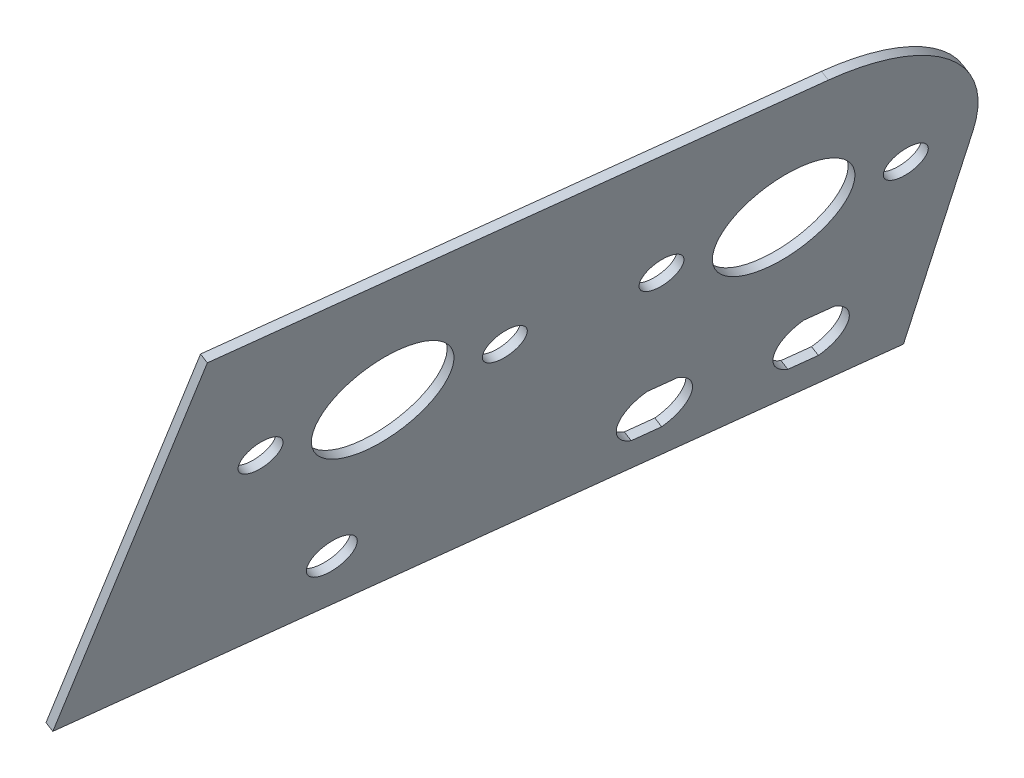
ISO-10303-21;
HEADER;
FILE_DESCRIPTION(('STEP AP214'),'2;1');
FILE_NAME('part.step','',(''),(''),'','','');
FILE_SCHEMA(('AUTOMOTIVE_DESIGN { 1 0 10303 214 1 1 1 1 }'));
ENDSEC;
DATA;
#1=APPLICATION_CONTEXT('core data for automotive mechanical design processes');
#2=APPLICATION_PROTOCOL_DEFINITION('international standard','automotive_design',2000,#1);
#3=PRODUCT_CONTEXT('',#1,'mechanical');
#4=PRODUCT('Part','Part','',(#3));
#5=PRODUCT_RELATED_PRODUCT_CATEGORY('part','',(#4));
#6=PRODUCT_DEFINITION_FORMATION('','',#4);
#7=PRODUCT_DEFINITION_CONTEXT('part definition',#1,'design');
#8=PRODUCT_DEFINITION('design','',#6,#7);
#9=PRODUCT_DEFINITION_SHAPE('','',#8);
#10=(LENGTH_UNIT() NAMED_UNIT(*) SI_UNIT(.MILLI.,.METRE.));
#11=(NAMED_UNIT(*) PLANE_ANGLE_UNIT() SI_UNIT($,.RADIAN.));
#12=(NAMED_UNIT(*) SI_UNIT($,.STERADIAN.) SOLID_ANGLE_UNIT());
#13=UNCERTAINTY_MEASURE_WITH_UNIT(LENGTH_MEASURE(1.E-05),#10,'distance_accuracy_value','');
#14=(GEOMETRIC_REPRESENTATION_CONTEXT(3) GLOBAL_UNCERTAINTY_ASSIGNED_CONTEXT((#13)) GLOBAL_UNIT_ASSIGNED_CONTEXT((#10,
#11,#12)) REPRESENTATION_CONTEXT('',''));
#15=CARTESIAN_POINT('',(0.,0.,0.));
#16=DIRECTION('',(0.,0.,1.));
#17=DIRECTION('',(1.,0.,0.));
#18=AXIS2_PLACEMENT_3D('',#15,#16,#17);
#19=CARTESIAN_POINT('',(-325.727767332464,404.275308145903,-253.984029335948));
#20=DIRECTION('',(-0.923798474245107,0.360095662141425,-0.130105699680456));
#21=DIRECTION('',(-0.363182667764731,-0.931717956162321,0.));
#22=AXIS2_PLACEMENT_3D('',#19,#20,#21);
#23=PLANE('',#22);
#24=CARTESIAN_POINT('',(-322.735755727218,404.882734459944,-273.547232034563));
#25=DIRECTION('',(-0.923798474245107,0.360095662141425,-0.130105699680456));
#26=DIRECTION('',(-0.363182667764731,-0.931717956162321,0.));
#27=AXIS2_PLACEMENT_3D('',#24,#25,#26);
#28=CIRCLE('',#27,3.55);
#29=CARTESIAN_POINT('',(-324.025054197783,401.575135715567,-273.547232034563));
#30=VERTEX_POINT('',#29);
#31=EDGE_CURVE('E207',#30,#30,#28,.T.);
#32=ORIENTED_EDGE('',*,*,#31,.F.);
#33=EDGE_LOOP('',(#32));
#34=FACE_BOUND('',#33,.T.);
#35=CARTESIAN_POINT('',(-325.727767332464,404.275308145903,-253.984029335948));
#36=DIRECTION('',(-0.923798474245107,0.360095662141425,-0.130105699680456));
#37=DIRECTION('',(-0.363182667764731,-0.931717956162321,0.));
#38=AXIS2_PLACEMENT_3D('',#35,#36,#37);
#39=CIRCLE('',#38,11.25);
#40=CARTESIAN_POINT('',(-329.813572344817,393.793481139077,-253.984029335948));
#41=VERTEX_POINT('',#40);
#42=EDGE_CURVE('E219',#41,#41,#39,.T.);
#43=ORIENTED_EDGE('',*,*,#42,.F.);
#44=EDGE_LOOP('',(#43));
#45=FACE_BOUND('',#44,.T.);
#46=CARTESIAN_POINT('',(-338.542039257965,401.673805548396,-170.198191515619));
#47=DIRECTION('',(-0.923798474245107,0.360095662141425,-0.130105699680456));
#48=DIRECTION('',(-0.363182667764731,-0.931717956162321,0.));
#49=AXIS2_PLACEMENT_3D('',#46,#47,#48);
#50=CIRCLE('',#49,3.54999999999999);
#51=CARTESIAN_POINT('',(-339.83133772853,398.366206804019,-170.198191515619));
#52=VERTEX_POINT('',#51);
#53=EDGE_CURVE('E231',#52,#52,#50,.T.);
#54=ORIENTED_EDGE('',*,*,#53,.F.);
#55=EDGE_LOOP('',(#54));
#56=FACE_BOUND('',#55,.T.);
#57=DIRECTION('',(-0.351797717362219,-0.932410836751544,-0.0827550455683421));
#58=VECTOR('',#57,1.);
#59=CARTESIAN_POINT('',(-321.092416019791,405.216358761216,-284.292172910696));
#60=LINE('',#59,#58);
#61=CARTESIAN_POINT('',(-321.092416019791,405.216358761216,-284.292172910696));
#62=VERTEX_POINT('',#61);
#63=CARTESIAN_POINT('',(-337.846782309166,360.810292660924,-288.233381955888));
#64=VERTEX_POINT('',#63);
#65=EDGE_CURVE('E243',#62,#64,#60,.T.);
#66=ORIENTED_EDGE('',*,*,#65,.T.);
#67=DIRECTION('',(-0.151111697234675,-0.0306780966687199,0.98804054033407));
#68=VECTOR('',#67,1.);
#69=CARTESIAN_POINT('',(-337.846782309166,360.810292660924,-288.233381955888));
#70=LINE('',#69,#68);
#71=CARTESIAN_POINT('',(-358.684680395967,356.579865344056,-151.985239278129));
#72=VERTEX_POINT('',#71);
#73=EDGE_CURVE('E246',#64,#72,#70,.T.);
#74=ORIENTED_EDGE('',*,*,#73,.T.);
#75=DIRECTION('',(0.363182667764731,0.931717956162321,0.));
#76=VECTOR('',#75,1.);
#77=CARTESIAN_POINT('',(-358.684680395967,356.579865344056,-151.985239278129));
#78=LINE('',#77,#76);
#79=CARTESIAN_POINT('',(-330.147905643647,429.78882548342,-151.985239278129));
#80=VERTEX_POINT('',#79);
#81=EDGE_CURVE('E249',#72,#80,#78,.T.);
#82=ORIENTED_EDGE('',*,*,#81,.T.);
#83=DIRECTION('',(0.151111697234675,0.0306780966687195,-0.98804054033407));
#84=VECTOR('',#83,1.);
#85=CARTESIAN_POINT('',(-330.147905643647,429.78882548342,-151.985239278129));
#86=LINE('',#85,#84);
#87=CARTESIAN_POINT('',(-314.936372352378,432.877010563257,-251.44551831314));
#88=VERTEX_POINT('',#87);
#89=EDGE_CURVE('E251',#80,#88,#86,.T.);
#90=ORIENTED_EDGE('',*,*,#89,.T.);
#91=CARTESIAN_POINT('',(-325.727767332464,404.275308145903,-253.984029335948));
#92=DIRECTION('',(-0.923798474245107,0.360095662141425,-0.130105699680456));
#93=DIRECTION('',(-0.363182667764731,-0.931717956162321,0.));
#94=AXIS2_PLACEMENT_3D('',#91,#92,#93);
#95=CIRCLE('',#94,30.675);
#96=EDGE_CURVE('E253',#88,#62,#95,.T.);
#97=ORIENTED_EDGE('',*,*,#96,.T.);
#98=EDGE_LOOP('',(#66,#74,#82,#90,#97));
#99=FACE_BOUND('',#98,.T.);
#100=CARTESIAN_POINT('',(-335.550027652718,402.281231862436,-189.761394214234));
#101=DIRECTION('',(-0.923798474245107,0.360095662141425,-0.130105699680456));
#102=DIRECTION('',(-0.363182667764731,-0.931717956162321,0.));
#103=AXIS2_PLACEMENT_3D('',#100,#101,#102);
#104=CIRCLE('',#103,11.25);
#105=CARTESIAN_POINT('',(-339.635832665071,391.79940485561,-189.761394214234));
#106=VERTEX_POINT('',#105);
#107=EDGE_CURVE('E237',#106,#106,#104,.T.);
#108=ORIENTED_EDGE('',*,*,#107,.F.);
#109=EDGE_LOOP('',(#108));
#110=FACE_BOUND('',#109,.T.);
#111=CARTESIAN_POINT('',(-332.558016047472,402.888658176477,-209.324596912848));
#112=DIRECTION('',(-0.923798474245107,0.360095662141425,-0.130105699680456));
#113=DIRECTION('',(-0.363182667764731,-0.931717956162321,0.));
#114=AXIS2_PLACEMENT_3D('',#111,#112,#113);
#115=CIRCLE('',#114,3.55);
#116=CARTESIAN_POINT('',(-333.847314518036,399.581059432101,-209.324596912848));
#117=VERTEX_POINT('',#116);
#118=EDGE_CURVE('E225',#117,#117,#115,.T.);
#119=ORIENTED_EDGE('',*,*,#118,.F.);
#120=EDGE_LOOP('',(#119));
#121=FACE_BOUND('',#120,.T.);
#122=CARTESIAN_POINT('',(-328.719778937711,403.667881831862,-234.420826637334));
#123=DIRECTION('',(-0.923798474245107,0.360095662141425,-0.130105699680456));
#124=DIRECTION('',(-0.363182667764731,-0.931717956162321,0.));
#125=AXIS2_PLACEMENT_3D('',#122,#123,#124);
#126=CIRCLE('',#125,3.55000000000002);
#127=CARTESIAN_POINT('',(-330.009077408276,400.360283087486,-234.420826637334));
#128=VERTEX_POINT('',#127);
#129=EDGE_CURVE('E213',#128,#128,#126,.T.);
#130=ORIENTED_EDGE('',*,*,#129,.F.);
#131=EDGE_LOOP('',(#130));
#132=FACE_BOUND('',#131,.T.);
#133=CARTESIAN_POINT('',(-347.836562931594,369.716783388889,-192.651614180708));
#134=DIRECTION('',(-0.923798474245107,0.360095662141425,-0.130105699680456));
#135=DIRECTION('',(-0.363182667764731,-0.931717956162321,0.));
#136=AXIS2_PLACEMENT_3D('',#133,#134,#135);
#137=CIRCLE('',#136,4.024999951);
#138=CARTESIAN_POINT('',(-349.298373151551,365.966618660989,-192.651614180708));
#139=VERTEX_POINT('',#138);
#140=EDGE_CURVE('E201',#139,#139,#137,.T.);
#141=ORIENTED_EDGE('',*,*,#140,.F.);
#142=EDGE_LOOP('',(#141));
#143=FACE_BOUND('',#142,.T.);
#144=DIRECTION('',(-0.151111697234677,-0.0306780966686925,0.98804054033407));
#145=VECTOR('',#144,1.);
#146=CARTESIAN_POINT('',(-337.65651983906,367.048048873044,-272.319976325119));
#147=LINE('',#146,#145);
#148=CARTESIAN_POINT('',(-337.65651983906,367.048048873044,-272.319976325119));
#149=VERTEX_POINT('',#148);
#150=CARTESIAN_POINT('',(-338.403623164843,366.896374922785,-267.435057505463));
#151=VERTEX_POINT('',#150);
#152=EDGE_CURVE('E172',#149,#151,#147,.T.);
#153=ORIENTED_EDGE('',*,*,#152,.F.);
#154=CARTESIAN_POINT('',(-336.09518405646,372.100471500048,-269.422364164665));
#155=DIRECTION('',(-0.923798474245107,0.360095662141425,-0.130105699680456));
#156=DIRECTION('',(-0.363182667764731,-0.931717956162321,0.));
#157=AXIS2_PLACEMENT_3D('',#154,#155,#156);
#158=CIRCLE('',#157,6.03000000500028);
#159=CARTESIAN_POINT('',(-333.786744948076,377.304568077311,-271.409670823867));
#160=VERTEX_POINT('',#159);
#161=EDGE_CURVE('E170',#160,#149,#158,.T.);
#162=ORIENTED_EDGE('',*,*,#161,.F.);
#163=DIRECTION('',(0.151111697234676,0.0306780966687149,-0.98804054033407));
#164=VECTOR('',#163,1.);
#165=CARTESIAN_POINT('',(-333.786744948076,377.304568077311,-271.409670823867));
#166=LINE('',#165,#164);
#167=CARTESIAN_POINT('',(-334.533848273859,377.152894127052,-266.524752004212));
#168=VERTEX_POINT('',#167);
#169=EDGE_CURVE('E178',#168,#160,#166,.T.);
#170=ORIENTED_EDGE('',*,*,#169,.F.);
#171=CARTESIAN_POINT('',(-336.09518405646,372.100471500048,-269.422364164665));
#172=DIRECTION('',(-0.923798474245107,0.360095662141425,-0.130105699680456));
#173=DIRECTION('',(-0.363182667764731,-0.931717956162321,0.));
#174=AXIS2_PLACEMENT_3D('',#171,#172,#173);
#175=CIRCLE('',#174,6.03000000500027);
#176=EDGE_CURVE('E175',#151,#168,#175,.T.);
#177=ORIENTED_EDGE('',*,*,#176,.F.);
#178=EDGE_LOOP('',(#153,#162,#170,#177));
#179=FACE_BOUND('',#178,.T.);
#180=DIRECTION('',(-0.151111697234677,-0.0306780966687151,0.98804054033407));
#181=VECTOR('',#180,1.);
#182=CARTESIAN_POINT('',(-341.494756946892,366.26882522277,-247.22374660018));
#183=LINE('',#182,#181);
#184=CARTESIAN_POINT('',(-341.494756946892,366.26882522277,-247.22374660018));
#185=VERTEX_POINT('',#184);
#186=CARTESIAN_POINT('',(-342.241860272675,366.117151272512,-242.338827780524));
#187=VERTEX_POINT('',#186);
#188=EDGE_CURVE('E142',#185,#187,#183,.T.);
#189=ORIENTED_EDGE('',*,*,#188,.F.);
#190=CARTESIAN_POINT('',(-339.93342116622,371.321247844663,-244.32613444018));
#191=DIRECTION('',(-0.923798474245107,0.360095662141425,-0.130105699680456));
#192=DIRECTION('',(-0.363182667764731,-0.931717956162321,0.));
#193=AXIS2_PLACEMENT_3D('',#190,#191,#192);
#194=CIRCLE('',#193,6.02999999999982);
#195=CARTESIAN_POINT('',(-337.624982059765,376.525344416814,-246.313441099836));
#196=VERTEX_POINT('',#195);
#197=EDGE_CURVE('E134',#196,#185,#194,.T.);
#198=ORIENTED_EDGE('',*,*,#197,.F.);
#199=DIRECTION('',(0.151111697234677,0.0306780966687263,-0.988040540334069));
#200=VECTOR('',#199,1.);
#201=CARTESIAN_POINT('',(-337.624982059765,376.525344416814,-246.313441099836));
#202=LINE('',#201,#200);
#203=CARTESIAN_POINT('',(-338.372085385548,376.373670466555,-241.42852228018));
#204=VERTEX_POINT('',#203);
#205=EDGE_CURVE('E156',#204,#196,#202,.T.);
#206=ORIENTED_EDGE('',*,*,#205,.F.);
#207=CARTESIAN_POINT('',(-339.93342116622,371.321247844663,-244.32613444018));
#208=DIRECTION('',(-0.923798474245107,0.360095662141425,-0.130105699680456));
#209=DIRECTION('',(-0.363182667764731,-0.931717956162321,0.));
#210=AXIS2_PLACEMENT_3D('',#207,#208,#209);
#211=CIRCLE('',#210,6.02999999999978);
#212=EDGE_CURVE('E154',#187,#204,#211,.T.);
#213=ORIENTED_EDGE('',*,*,#212,.F.);
#214=EDGE_LOOP('',(#189,#198,#206,#213));
#215=FACE_BOUND('',#214,.T.);
#216=ADVANCED_FACE('F39',(#34,#45,#56,#99,#110,#121,#132,#143,#179,#215),#23,.T.);
#217=CARTESIAN_POINT('',(-324.2612372546,403.703656282254,-253.777486537706));
#218=DIRECTION('',(-0.923798474245107,0.360095662141425,-0.130105699680456));
#219=DIRECTION('',(-0.363182667764731,-0.931717956162321,0.));
#220=AXIS2_PLACEMENT_3D('',#217,#218,#219);
#221=PLANE('',#220);
#222=CARTESIAN_POINT('',(-334.628653978595,371.528819636399,-269.215821366423));
#223=DIRECTION('',(-0.923798474245107,0.360095662141425,-0.130105699680456));
#224=DIRECTION('',(-0.363182667764731,-0.931717956162321,0.));
#225=AXIS2_PLACEMENT_3D('',#222,#223,#224);
#226=CIRCLE('',#225,6.03000000500028);
#227=CARTESIAN_POINT('',(-332.320214870212,376.732916213662,-271.203128025625));
#228=VERTEX_POINT('',#227);
#229=CARTESIAN_POINT('',(-336.189989761196,366.476397009394,-272.113433526876));
#230=VERTEX_POINT('',#229);
#231=EDGE_CURVE('E150',#228,#230,#226,.T.);
#232=ORIENTED_EDGE('',*,*,#231,.T.);
#233=DIRECTION('',(-0.151111697234677,-0.0306780966686925,0.98804054033407));
#234=VECTOR('',#233,1.);
#235=CARTESIAN_POINT('',(-336.189989761196,366.476397009394,-272.113433526876));
#236=LINE('',#235,#234);
#237=CARTESIAN_POINT('',(-336.937093086979,366.324723059136,-267.22851470722));
#238=VERTEX_POINT('',#237);
#239=EDGE_CURVE('E183',#230,#238,#236,.T.);
#240=ORIENTED_EDGE('',*,*,#239,.T.);
#241=CARTESIAN_POINT('',(-334.628653978595,371.528819636399,-269.215821366423));
#242=DIRECTION('',(-0.923798474245107,0.360095662141425,-0.130105699680456));
#243=DIRECTION('',(-0.363182667764731,-0.931717956162321,0.));
#244=AXIS2_PLACEMENT_3D('',#241,#242,#243);
#245=CIRCLE('',#244,6.03000000500027);
#246=CARTESIAN_POINT('',(-333.067318195995,376.581242263403,-266.318209205969));
#247=VERTEX_POINT('',#246);
#248=EDGE_CURVE('E186',#238,#247,#245,.T.);
#249=ORIENTED_EDGE('',*,*,#248,.T.);
#250=DIRECTION('',(0.151111697234676,0.0306780966687149,-0.98804054033407));
#251=VECTOR('',#250,1.);
#252=CARTESIAN_POINT('',(-332.320214870212,376.732916213662,-271.203128025625));
#253=LINE('',#252,#251);
#254=EDGE_CURVE('E173',#247,#228,#253,.T.);
#255=ORIENTED_EDGE('',*,*,#254,.T.);
#256=EDGE_LOOP('',(#232,#240,#249,#255));
#257=FACE_BOUND('',#256,.T.);
#258=DIRECTION('',(-0.351797717362219,-0.932410836751544,-0.0827550455683421));
#259=VECTOR('',#258,1.);
#260=CARTESIAN_POINT('',(-319.625885941926,404.644706897567,-284.085630112453));
#261=LINE('',#260,#259);
#262=CARTESIAN_POINT('',(-319.625885941926,404.644706897567,-284.085630112453));
#263=VERTEX_POINT('',#262);
#264=CARTESIAN_POINT('',(-336.380252231302,360.238640797274,-288.026839157646));
#265=VERTEX_POINT('',#264);
#266=EDGE_CURVE('E240',#263,#265,#261,.T.);
#267=ORIENTED_EDGE('',*,*,#266,.F.);
#268=CARTESIAN_POINT('',(-324.2612372546,403.703656282254,-253.777486537706));
#269=DIRECTION('',(-0.923798474245107,0.360095662141425,-0.130105699680456));
#270=DIRECTION('',(-0.363182667764731,-0.931717956162321,0.));
#271=AXIS2_PLACEMENT_3D('',#268,#269,#270);
#272=CIRCLE('',#271,30.675);
#273=CARTESIAN_POINT('',(-313.469842274514,432.305358699607,-251.238975514897));
#274=VERTEX_POINT('',#273);
#275=EDGE_CURVE('E247',#274,#263,#272,.T.);
#276=ORIENTED_EDGE('',*,*,#275,.F.);
#277=DIRECTION('',(0.151111697234675,0.0306780966687195,-0.98804054033407));
#278=VECTOR('',#277,1.);
#279=CARTESIAN_POINT('',(-328.681375565783,429.21717361977,-151.778696479886));
#280=LINE('',#279,#278);
#281=CARTESIAN_POINT('',(-328.681375565783,429.21717361977,-151.778696479886));
#282=VERTEX_POINT('',#281);
#283=EDGE_CURVE('E262',#282,#274,#280,.T.);
#284=ORIENTED_EDGE('',*,*,#283,.F.);
#285=DIRECTION('',(0.363182667764731,0.931717956162321,0.));
#286=VECTOR('',#285,1.);
#287=CARTESIAN_POINT('',(-357.218150318102,356.008213480407,-151.778696479886));
#288=LINE('',#287,#286);
#289=CARTESIAN_POINT('',(-357.218150318102,356.008213480407,-151.778696479886));
#290=VERTEX_POINT('',#289);
#291=EDGE_CURVE('E260',#290,#282,#288,.T.);
#292=ORIENTED_EDGE('',*,*,#291,.F.);
#293=DIRECTION('',(-0.151111697234675,-0.0306780966687199,0.98804054033407));
#294=VECTOR('',#293,1.);
#295=CARTESIAN_POINT('',(-336.380252231302,360.238640797274,-288.026839157646));
#296=LINE('',#295,#294);
#297=EDGE_CURVE('E258',#265,#290,#296,.T.);
#298=ORIENTED_EDGE('',*,*,#297,.F.);
#299=EDGE_LOOP('',(#267,#276,#284,#292,#298));
#300=FACE_BOUND('',#299,.T.);
#301=CARTESIAN_POINT('',(-334.083497574854,401.709579998787,-189.554851415991));
#302=DIRECTION('',(-0.923798474245107,0.360095662141425,-0.130105699680456));
#303=DIRECTION('',(-0.363182667764731,-0.931717956162321,0.));
#304=AXIS2_PLACEMENT_3D('',#301,#302,#303);
#305=CIRCLE('',#304,11.25);
#306=CARTESIAN_POINT('',(-338.169302587207,391.227752991961,-189.554851415991));
#307=VERTEX_POINT('',#306);
#308=EDGE_CURVE('E234',#307,#307,#305,.T.);
#309=ORIENTED_EDGE('',*,*,#308,.T.);
#310=EDGE_LOOP('',(#309));
#311=FACE_BOUND('',#310,.T.);
#312=CARTESIAN_POINT('',(-337.075509180101,401.102153684746,-169.991648717377));
#313=DIRECTION('',(-0.923798474245107,0.360095662141425,-0.130105699680456));
#314=DIRECTION('',(-0.363182667764731,-0.931717956162321,0.));
#315=AXIS2_PLACEMENT_3D('',#312,#313,#314);
#316=CIRCLE('',#315,3.54999999999999);
#317=CARTESIAN_POINT('',(-338.364807650665,397.79455494037,-169.991648717377));
#318=VERTEX_POINT('',#317);
#319=EDGE_CURVE('E228',#318,#318,#316,.T.);
#320=ORIENTED_EDGE('',*,*,#319,.T.);
#321=EDGE_LOOP('',(#320));
#322=FACE_BOUND('',#321,.T.);
#323=CARTESIAN_POINT('',(-331.091485969607,402.317006312827,-209.118054114606));
#324=DIRECTION('',(-0.923798474245107,0.360095662141425,-0.130105699680456));
#325=DIRECTION('',(-0.363182667764731,-0.931717956162321,0.));
#326=AXIS2_PLACEMENT_3D('',#323,#324,#325);
#327=CIRCLE('',#326,3.55);
#328=CARTESIAN_POINT('',(-332.380784440172,399.009407568451,-209.118054114606));
#329=VERTEX_POINT('',#328);
#330=EDGE_CURVE('E222',#329,#329,#327,.T.);
#331=ORIENTED_EDGE('',*,*,#330,.T.);
#332=EDGE_LOOP('',(#331));
#333=FACE_BOUND('',#332,.T.);
#334=CARTESIAN_POINT('',(-324.2612372546,403.703656282254,-253.777486537706));
#335=DIRECTION('',(-0.923798474245107,0.360095662141425,-0.130105699680456));
#336=DIRECTION('',(-0.363182667764731,-0.931717956162321,0.));
#337=AXIS2_PLACEMENT_3D('',#334,#335,#336);
#338=CIRCLE('',#337,11.25);
#339=CARTESIAN_POINT('',(-328.347042266953,393.221829275427,-253.777486537706));
#340=VERTEX_POINT('',#339);
#341=EDGE_CURVE('E216',#340,#340,#338,.T.);
#342=ORIENTED_EDGE('',*,*,#341,.T.);
#343=EDGE_LOOP('',(#342));
#344=FACE_BOUND('',#343,.T.);
#345=CARTESIAN_POINT('',(-327.253248859847,403.096229968213,-234.214283839091));
#346=DIRECTION('',(-0.923798474245107,0.360095662141425,-0.130105699680456));
#347=DIRECTION('',(-0.363182667764731,-0.931717956162321,0.));
#348=AXIS2_PLACEMENT_3D('',#345,#346,#347);
#349=CIRCLE('',#348,3.55000000000002);
#350=CARTESIAN_POINT('',(-328.542547330412,399.788631223837,-234.214283839091));
#351=VERTEX_POINT('',#350);
#352=EDGE_CURVE('E210',#351,#351,#349,.T.);
#353=ORIENTED_EDGE('',*,*,#352,.T.);
#354=EDGE_LOOP('',(#353));
#355=FACE_BOUND('',#354,.T.);
#356=CARTESIAN_POINT('',(-321.269225649354,404.311082596294,-273.34068923632));
#357=DIRECTION('',(-0.923798474245107,0.360095662141425,-0.130105699680456));
#358=DIRECTION('',(-0.363182667764731,-0.931717956162321,0.));
#359=AXIS2_PLACEMENT_3D('',#356,#357,#358);
#360=CIRCLE('',#359,3.55);
#361=CARTESIAN_POINT('',(-322.558524119918,401.003483851918,-273.34068923632));
#362=VERTEX_POINT('',#361);
#363=EDGE_CURVE('E204',#362,#362,#360,.T.);
#364=ORIENTED_EDGE('',*,*,#363,.T.);
#365=EDGE_LOOP('',(#364));
#366=FACE_BOUND('',#365,.T.);
#367=CARTESIAN_POINT('',(-346.37003285373,369.145131525239,-192.445071382465));
#368=DIRECTION('',(-0.923798474245107,0.360095662141425,-0.130105699680456));
#369=DIRECTION('',(-0.363182667764731,-0.931717956162321,0.));
#370=AXIS2_PLACEMENT_3D('',#367,#368,#369);
#371=CIRCLE('',#370,4.024999951);
#372=CARTESIAN_POINT('',(-347.831843073687,365.39496679734,-192.445071382465));
#373=VERTEX_POINT('',#372);
#374=EDGE_CURVE('E200',#373,#373,#371,.T.);
#375=ORIENTED_EDGE('',*,*,#374,.T.);
#376=EDGE_LOOP('',(#375));
#377=FACE_BOUND('',#376,.T.);
#378=CARTESIAN_POINT('',(-338.466891088356,370.749595981013,-244.119591641937));
#379=DIRECTION('',(-0.923798474245107,0.360095662141425,-0.130105699680456));
#380=DIRECTION('',(-0.363182667764731,-0.931717956162321,0.));
#381=AXIS2_PLACEMENT_3D('',#378,#379,#380);
#382=CIRCLE('',#381,6.02999999999982);
#383=CARTESIAN_POINT('',(-336.158451981901,375.953692553164,-246.106898301593));
#384=VERTEX_POINT('',#383);
#385=CARTESIAN_POINT('',(-340.028226869028,365.697173359121,-247.017203801937));
#386=VERTEX_POINT('',#385);
#387=EDGE_CURVE('E62',#384,#386,#382,.T.);
#388=ORIENTED_EDGE('',*,*,#387,.T.);
#389=DIRECTION('',(-0.151111697234677,-0.0306780966687151,0.98804054033407));
#390=VECTOR('',#389,1.);
#391=CARTESIAN_POINT('',(-340.028226869028,365.697173359121,-247.017203801937));
#392=LINE('',#391,#390);
#393=CARTESIAN_POINT('',(-340.775330194811,365.545499408862,-242.132284982281));
#394=VERTEX_POINT('',#393);
#395=EDGE_CURVE('E149',#386,#394,#392,.T.);
#396=ORIENTED_EDGE('',*,*,#395,.T.);
#397=CARTESIAN_POINT('',(-338.466891088356,370.749595981013,-244.119591641937));
#398=DIRECTION('',(-0.923798474245107,0.360095662141425,-0.130105699680456));
#399=DIRECTION('',(-0.363182667764731,-0.931717956162321,0.));
#400=AXIS2_PLACEMENT_3D('',#397,#398,#399);
#401=CIRCLE('',#400,6.02999999999978);
#402=CARTESIAN_POINT('',(-336.905555307684,375.802018602905,-241.221979481937));
#403=VERTEX_POINT('',#402);
#404=EDGE_CURVE('E162',#394,#403,#401,.T.);
#405=ORIENTED_EDGE('',*,*,#404,.T.);
#406=DIRECTION('',(0.151111697234677,0.0306780966687263,-0.988040540334069));
#407=VECTOR('',#406,1.);
#408=CARTESIAN_POINT('',(-336.158451981901,375.953692553164,-246.106898301593));
#409=LINE('',#408,#407);
#410=EDGE_CURVE('E143',#403,#384,#409,.T.);
#411=ORIENTED_EDGE('',*,*,#410,.T.);
#412=EDGE_LOOP('',(#388,#396,#405,#411));
#413=FACE_BOUND('',#412,.T.);
#414=ADVANCED_FACE('F283',(#257,#300,#311,#322,#333,#344,#355,#366,#377,#413),#221,.F.);
#415=CARTESIAN_POINT('',(-321.092416019791,405.216358761216,-284.292172910696));
#416=DIRECTION('',(-0.151111697234675,-0.0306780966687198,0.98804054033407));
#417=DIRECTION('',(0.988505813788488,0.,0.151182856522685));
#418=AXIS2_PLACEMENT_3D('',#415,#416,#417);
#419=PLANE('',#418);
#420=ORIENTED_EDGE('',*,*,#266,.T.);
#421=DIRECTION('',(0.923798474245107,-0.360095662141425,0.130105699680456));
#422=VECTOR('',#421,1.);
#423=CARTESIAN_POINT('',(-337.846782309166,360.810292660924,-288.233381955888));
#424=LINE('',#423,#422);
#425=EDGE_CURVE('E11',#64,#265,#424,.T.);
#426=ORIENTED_EDGE('',*,*,#425,.F.);
#427=ORIENTED_EDGE('',*,*,#65,.F.);
#428=DIRECTION('',(0.923798474245107,-0.360095662141425,0.130105699680456));
#429=VECTOR('',#428,1.);
#430=CARTESIAN_POINT('',(-321.092416019791,405.216358761216,-284.292172910696));
#431=LINE('',#430,#429);
#432=EDGE_CURVE('E255',#62,#263,#431,.T.);
#433=ORIENTED_EDGE('',*,*,#432,.T.);
#434=EDGE_LOOP('',(#420,#426,#427,#433));
#435=FACE_BOUND('',#434,.T.);
#436=ADVANCED_FACE('F41',(#435),#419,.F.);
#437=CARTESIAN_POINT('',(-337.846782309166,360.810292660924,-288.233381955888));
#438=DIRECTION('',(0.35179771736222,0.932410836751543,0.0827550455683423));
#439=DIRECTION('',(-0.935620089925283,0.353008565516766,0.));
#440=AXIS2_PLACEMENT_3D('',#437,#438,#439);
#441=PLANE('',#440);
#442=ORIENTED_EDGE('',*,*,#297,.T.);
#443=DIRECTION('',(0.923798474245107,-0.360095662141425,0.130105699680456));
#444=VECTOR('',#443,1.);
#445=CARTESIAN_POINT('',(-358.684680395967,356.579865344056,-151.985239278129));
#446=LINE('',#445,#444);
#447=EDGE_CURVE('E47',#72,#290,#446,.T.);
#448=ORIENTED_EDGE('',*,*,#447,.F.);
#449=ORIENTED_EDGE('',*,*,#73,.F.);
#450=ORIENTED_EDGE('',*,*,#425,.T.);
#451=EDGE_LOOP('',(#442,#448,#449,#450));
#452=FACE_BOUND('',#451,.T.);
#453=ADVANCED_FACE('F298',(#452),#441,.F.);
#454=CARTESIAN_POINT('',(-358.684680395967,356.579865344056,-151.985239278129));
#455=DIRECTION('',(0.121221816591343,-0.0472521351013463,-0.991500129556552));
#456=DIRECTION('',(-0.99260887961784,0.,-0.121357373504114));
#457=AXIS2_PLACEMENT_3D('',#454,#455,#456);
#458=PLANE('',#457);
#459=ORIENTED_EDGE('',*,*,#291,.T.);
#460=DIRECTION('',(0.923798474245107,-0.360095662141425,0.130105699680456));
#461=VECTOR('',#460,1.);
#462=CARTESIAN_POINT('',(-330.147905643647,429.78882548342,-151.985239278129));
#463=LINE('',#462,#461);
#464=EDGE_CURVE('E270',#80,#282,#463,.T.);
#465=ORIENTED_EDGE('',*,*,#464,.F.);
#466=ORIENTED_EDGE('',*,*,#81,.F.);
#467=ORIENTED_EDGE('',*,*,#447,.T.);
#468=EDGE_LOOP('',(#459,#465,#466,#467));
#469=FACE_BOUND('',#468,.T.);
#470=ADVANCED_FACE('F277',(#469),#458,.F.);
#471=CARTESIAN_POINT('',(-330.147905643647,429.78882548342,-151.985239278129));
#472=DIRECTION('',(-0.35179771736222,-0.932410836751543,-0.0827550455683418));
#473=DIRECTION('',(0.935620089925283,-0.353008565516766,0.));
#474=AXIS2_PLACEMENT_3D('',#471,#472,#473);
#475=PLANE('',#474);
#476=ORIENTED_EDGE('',*,*,#283,.T.);
#477=DIRECTION('',(0.923798474245107,-0.360095662141425,0.130105699680456));
#478=VECTOR('',#477,1.);
#479=CARTESIAN_POINT('',(-314.936372352378,432.877010563257,-251.44551831314));
#480=LINE('',#479,#478);
#481=EDGE_CURVE('E267',#88,#274,#480,.T.);
#482=ORIENTED_EDGE('',*,*,#481,.F.);
#483=ORIENTED_EDGE('',*,*,#89,.F.);
#484=ORIENTED_EDGE('',*,*,#464,.T.);
#485=EDGE_LOOP('',(#476,#482,#483,#484));
#486=FACE_BOUND('',#485,.T.);
#487=ADVANCED_FACE('F288',(#486),#475,.F.);
#488=CARTESIAN_POINT('',(-325.727767332464,404.275308145903,-253.984029335948));
#489=DIRECTION('',(0.923798474245107,-0.360095662141425,0.130105699680456));
#490=DIRECTION('',(0.363182667764731,0.931717956162321,0.));
#491=AXIS2_PLACEMENT_3D('',#488,#489,#490);
#492=CYLINDRICAL_SURFACE('',#491,30.675);
#493=ORIENTED_EDGE('',*,*,#275,.T.);
#494=ORIENTED_EDGE('',*,*,#432,.F.);
#495=ORIENTED_EDGE('',*,*,#96,.F.);
#496=ORIENTED_EDGE('',*,*,#481,.T.);
#497=EDGE_LOOP('',(#493,#494,#495,#496));
#498=FACE_BOUND('',#497,.T.);
#499=ADVANCED_FACE('F292',(#498),#492,.T.);
#500=CARTESIAN_POINT('',(-335.550027652718,402.281231862436,-189.761394214234));
#501=DIRECTION('',(0.923798474245107,-0.360095662141425,0.130105699680456));
#502=DIRECTION('',(0.363182667764731,0.931717956162321,0.));
#503=AXIS2_PLACEMENT_3D('',#500,#501,#502);
#504=CYLINDRICAL_SURFACE('',#503,11.25);
#505=ORIENTED_EDGE('',*,*,#107,.T.);
#506=EDGE_LOOP('',(#505));
#507=FACE_BOUND('',#506,.T.);
#508=ORIENTED_EDGE('',*,*,#308,.F.);
#509=EDGE_LOOP('',(#508));
#510=FACE_BOUND('',#509,.T.);
#511=ADVANCED_FACE('F315',(#507,#510),#504,.F.);
#512=CARTESIAN_POINT('',(-338.542039257965,401.673805548396,-170.198191515619));
#513=DIRECTION('',(0.923798474245107,-0.360095662141425,0.130105699680456));
#514=DIRECTION('',(0.363182667764731,0.931717956162321,0.));
#515=AXIS2_PLACEMENT_3D('',#512,#513,#514);
#516=CYLINDRICAL_SURFACE('',#515,3.54999999999999);
#517=ORIENTED_EDGE('',*,*,#53,.T.);
#518=EDGE_LOOP('',(#517));
#519=FACE_BOUND('',#518,.T.);
#520=ORIENTED_EDGE('',*,*,#319,.F.);
#521=EDGE_LOOP('',(#520));
#522=FACE_BOUND('',#521,.T.);
#523=ADVANCED_FACE('F344',(#519,#522),#516,.F.);
#524=CARTESIAN_POINT('',(-332.558016047472,402.888658176477,-209.324596912848));
#525=DIRECTION('',(0.923798474245107,-0.360095662141425,0.130105699680456));
#526=DIRECTION('',(0.363182667764731,0.931717956162321,0.));
#527=AXIS2_PLACEMENT_3D('',#524,#525,#526);
#528=CYLINDRICAL_SURFACE('',#527,3.55);
#529=ORIENTED_EDGE('',*,*,#118,.T.);
#530=EDGE_LOOP('',(#529));
#531=FACE_BOUND('',#530,.T.);
#532=ORIENTED_EDGE('',*,*,#330,.F.);
#533=EDGE_LOOP('',(#532));
#534=FACE_BOUND('',#533,.T.);
#535=ADVANCED_FACE('F352',(#531,#534),#528,.F.);
#536=CARTESIAN_POINT('',(-325.727767332464,404.275308145903,-253.984029335948));
#537=DIRECTION('',(0.923798474245107,-0.360095662141425,0.130105699680456));
#538=DIRECTION('',(0.363182667764731,0.931717956162321,0.));
#539=AXIS2_PLACEMENT_3D('',#536,#537,#538);
#540=CYLINDRICAL_SURFACE('',#539,11.25);
#541=ORIENTED_EDGE('',*,*,#42,.T.);
#542=EDGE_LOOP('',(#541));
#543=FACE_BOUND('',#542,.T.);
#544=ORIENTED_EDGE('',*,*,#341,.F.);
#545=EDGE_LOOP('',(#544));
#546=FACE_BOUND('',#545,.T.);
#547=ADVANCED_FACE('F360',(#543,#546),#540,.F.);
#548=CARTESIAN_POINT('',(-328.719778937711,403.667881831862,-234.420826637334));
#549=DIRECTION('',(0.923798474245107,-0.360095662141425,0.130105699680456));
#550=DIRECTION('',(0.363182667764731,0.931717956162321,0.));
#551=AXIS2_PLACEMENT_3D('',#548,#549,#550);
#552=CYLINDRICAL_SURFACE('',#551,3.55000000000002);
#553=ORIENTED_EDGE('',*,*,#129,.T.);
#554=EDGE_LOOP('',(#553));
#555=FACE_BOUND('',#554,.T.);
#556=ORIENTED_EDGE('',*,*,#352,.F.);
#557=EDGE_LOOP('',(#556));
#558=FACE_BOUND('',#557,.T.);
#559=ADVANCED_FACE('F369',(#555,#558),#552,.F.);
#560=CARTESIAN_POINT('',(-322.735755727218,404.882734459944,-273.547232034563));
#561=DIRECTION('',(0.923798474245107,-0.360095662141425,0.130105699680456));
#562=DIRECTION('',(0.363182667764731,0.931717956162321,0.));
#563=AXIS2_PLACEMENT_3D('',#560,#561,#562);
#564=CYLINDRICAL_SURFACE('',#563,3.55);
#565=ORIENTED_EDGE('',*,*,#31,.T.);
#566=EDGE_LOOP('',(#565));
#567=FACE_BOUND('',#566,.T.);
#568=ORIENTED_EDGE('',*,*,#363,.F.);
#569=EDGE_LOOP('',(#568));
#570=FACE_BOUND('',#569,.T.);
#571=ADVANCED_FACE('F378',(#567,#570),#564,.F.);
#572=CARTESIAN_POINT('',(-347.836562931594,369.716783388889,-192.651614180708));
#573=DIRECTION('',(0.923798474245107,-0.360095662141425,0.130105699680456));
#574=DIRECTION('',(0.363182667764731,0.931717956162321,0.));
#575=AXIS2_PLACEMENT_3D('',#572,#573,#574);
#576=CYLINDRICAL_SURFACE('',#575,4.024999951);
#577=ORIENTED_EDGE('',*,*,#140,.T.);
#578=EDGE_LOOP('',(#577));
#579=FACE_BOUND('',#578,.T.);
#580=ORIENTED_EDGE('',*,*,#374,.F.);
#581=EDGE_LOOP('',(#580));
#582=FACE_BOUND('',#581,.T.);
#583=ADVANCED_FACE('F387',(#579,#582),#576,.F.);
#584=CARTESIAN_POINT('',(-336.09518405646,372.100471500048,-269.422364164665));
#585=DIRECTION('',(0.923798474245107,-0.360095662141425,0.130105699680456));
#586=DIRECTION('',(0.363182667764731,0.931717956162321,0.));
#587=AXIS2_PLACEMENT_3D('',#584,#585,#586);
#588=CYLINDRICAL_SURFACE('',#587,6.03000000500028);
#589=ORIENTED_EDGE('',*,*,#231,.F.);
#590=DIRECTION('',(0.923798474245107,-0.360095662141425,0.130105699680456));
#591=VECTOR('',#590,1.);
#592=CARTESIAN_POINT('',(-333.786744948076,377.304568077311,-271.409670823867));
#593=LINE('',#592,#591);
#594=EDGE_CURVE('E180',#160,#228,#593,.T.);
#595=ORIENTED_EDGE('',*,*,#594,.F.);
#596=ORIENTED_EDGE('',*,*,#161,.T.);
#597=DIRECTION('',(0.923798474245107,-0.360095662141425,0.130105699680456));
#598=VECTOR('',#597,1.);
#599=CARTESIAN_POINT('',(-337.65651983906,367.048048873044,-272.319976325119));
#600=LINE('',#599,#598);
#601=EDGE_CURVE('E197',#149,#230,#600,.T.);
#602=ORIENTED_EDGE('',*,*,#601,.T.);
#603=EDGE_LOOP('',(#589,#595,#596,#602));
#604=FACE_BOUND('',#603,.T.);
#605=ADVANCED_FACE('F396',(#604),#588,.F.);
#606=CARTESIAN_POINT('',(-337.65651983906,367.048048873044,-272.319976325119));
#607=DIRECTION('',(0.351797717362224,0.932410836751544,0.0827550455683174));
#608=DIRECTION('',(-0.935620089925282,0.353008565516769,0.));
#609=AXIS2_PLACEMENT_3D('',#606,#607,#608);
#610=PLANE('',#609);
#611=ORIENTED_EDGE('',*,*,#239,.F.);
#612=ORIENTED_EDGE('',*,*,#601,.F.);
#613=ORIENTED_EDGE('',*,*,#152,.T.);
#614=DIRECTION('',(0.923798474245107,-0.360095662141425,0.130105699680456));
#615=VECTOR('',#614,1.);
#616=CARTESIAN_POINT('',(-338.403623164843,366.896374922785,-267.435057505463));
#617=LINE('',#616,#615);
#618=EDGE_CURVE('E195',#151,#238,#617,.T.);
#619=ORIENTED_EDGE('',*,*,#618,.T.);
#620=EDGE_LOOP('',(#611,#612,#613,#619));
#621=FACE_BOUND('',#620,.T.);
#622=ADVANCED_FACE('F405',(#621),#610,.T.);
#623=CARTESIAN_POINT('',(-336.09518405646,372.100471500048,-269.422364164665));
#624=DIRECTION('',(0.923798474245107,-0.360095662141425,0.130105699680456));
#625=DIRECTION('',(0.363182667764731,0.931717956162321,0.));
#626=AXIS2_PLACEMENT_3D('',#623,#624,#625);
#627=CYLINDRICAL_SURFACE('',#626,6.03000000500027);
#628=ORIENTED_EDGE('',*,*,#248,.F.);
#629=ORIENTED_EDGE('',*,*,#618,.F.);
#630=ORIENTED_EDGE('',*,*,#176,.T.);
#631=DIRECTION('',(0.923798474245107,-0.360095662141425,0.130105699680456));
#632=VECTOR('',#631,1.);
#633=CARTESIAN_POINT('',(-334.533848273859,377.152894127052,-266.524752004211));
#634=LINE('',#633,#632);
#635=EDGE_CURVE('E193',#168,#247,#634,.T.);
#636=ORIENTED_EDGE('',*,*,#635,.T.);
#637=EDGE_LOOP('',(#628,#629,#630,#636));
#638=FACE_BOUND('',#637,.T.);
#639=ADVANCED_FACE('F414',(#638),#627,.F.);
#640=CARTESIAN_POINT('',(-333.786744948076,377.304568077311,-271.409670823867));
#641=DIRECTION('',(-0.35179771736222,-0.932410836751544,-0.0827550455683381));
#642=DIRECTION('',(0.935620089925283,-0.353008565516766,0.));
#643=AXIS2_PLACEMENT_3D('',#640,#641,#642);
#644=PLANE('',#643);
#645=ORIENTED_EDGE('',*,*,#254,.F.);
#646=ORIENTED_EDGE('',*,*,#635,.F.);
#647=ORIENTED_EDGE('',*,*,#169,.T.);
#648=ORIENTED_EDGE('',*,*,#594,.T.);
#649=EDGE_LOOP('',(#645,#646,#647,#648));
#650=FACE_BOUND('',#649,.T.);
#651=ADVANCED_FACE('F423',(#650),#644,.T.);
#652=CARTESIAN_POINT('',(-339.93342116622,371.321247844663,-244.32613444018));
#653=DIRECTION('',(0.923798474245107,-0.360095662141425,0.130105699680456));
#654=DIRECTION('',(0.363182667764731,0.931717956162321,0.));
#655=AXIS2_PLACEMENT_3D('',#652,#653,#654);
#656=CYLINDRICAL_SURFACE('',#655,6.02999999999982);
#657=ORIENTED_EDGE('',*,*,#387,.F.);
#658=DIRECTION('',(0.923798474245107,-0.360095662141425,0.130105699680456));
#659=VECTOR('',#658,1.);
#660=CARTESIAN_POINT('',(-337.624982059765,376.525344416814,-246.313441099836));
#661=LINE('',#660,#659);
#662=EDGE_CURVE('E138',#196,#384,#661,.T.);
#663=ORIENTED_EDGE('',*,*,#662,.F.);
#664=ORIENTED_EDGE('',*,*,#197,.T.);
#665=DIRECTION('',(0.923798474245107,-0.360095662141425,0.130105699680456));
#666=VECTOR('',#665,1.);
#667=CARTESIAN_POINT('',(-341.494756946892,366.26882522277,-247.22374660018));
#668=LINE('',#667,#666);
#669=EDGE_CURVE('E137',#185,#386,#668,.T.);
#670=ORIENTED_EDGE('',*,*,#669,.T.);
#671=EDGE_LOOP('',(#657,#663,#664,#670));
#672=FACE_BOUND('',#671,.T.);
#673=ADVANCED_FACE('F136',(#672),#656,.F.);
#674=CARTESIAN_POINT('',(-341.494756946892,366.26882522277,-247.22374660018));
#675=DIRECTION('',(0.35179771736222,0.932410836751544,0.0827550455683386));
#676=DIRECTION('',(-0.935620089925283,0.353008565516766,0.));
#677=AXIS2_PLACEMENT_3D('',#674,#675,#676);
#678=PLANE('',#677);
#679=ORIENTED_EDGE('',*,*,#395,.F.);
#680=ORIENTED_EDGE('',*,*,#669,.F.);
#681=ORIENTED_EDGE('',*,*,#188,.T.);
#682=DIRECTION('',(0.923798474245107,-0.360095662141425,0.130105699680456));
#683=VECTOR('',#682,1.);
#684=CARTESIAN_POINT('',(-342.241860272675,366.117151272512,-242.338827780524));
#685=LINE('',#684,#683);
#686=EDGE_CURVE('E151',#187,#394,#685,.T.);
#687=ORIENTED_EDGE('',*,*,#686,.T.);
#688=EDGE_LOOP('',(#679,#680,#681,#687));
#689=FACE_BOUND('',#688,.T.);
#690=ADVANCED_FACE('F146',(#689),#678,.T.);
#691=CARTESIAN_POINT('',(-339.93342116622,371.321247844663,-244.32613444018));
#692=DIRECTION('',(0.923798474245107,-0.360095662141425,0.130105699680456));
#693=DIRECTION('',(0.363182667764731,0.931717956162321,0.));
#694=AXIS2_PLACEMENT_3D('',#691,#692,#693);
#695=CYLINDRICAL_SURFACE('',#694,6.02999999999978);
#696=ORIENTED_EDGE('',*,*,#404,.F.);
#697=ORIENTED_EDGE('',*,*,#686,.F.);
#698=ORIENTED_EDGE('',*,*,#212,.T.);
#699=DIRECTION('',(0.923798474245107,-0.360095662141425,0.130105699680456));
#700=VECTOR('',#699,1.);
#701=CARTESIAN_POINT('',(-338.372085385548,376.373670466555,-241.42852228018));
#702=LINE('',#701,#700);
#703=EDGE_CURVE('E54',#204,#403,#702,.T.);
#704=ORIENTED_EDGE('',*,*,#703,.T.);
#705=EDGE_LOOP('',(#696,#697,#698,#704));
#706=FACE_BOUND('',#705,.T.);
#707=ADVANCED_FACE('F447',(#706),#695,.F.);
#708=CARTESIAN_POINT('',(-337.624982059765,376.525344416814,-246.313441099836));
#709=DIRECTION('',(-0.351797717362219,-0.932410836751543,-0.0827550455683489));
#710=DIRECTION('',(0.935620089925284,-0.353008565516765,0.));
#711=AXIS2_PLACEMENT_3D('',#708,#709,#710);
#712=PLANE('',#711);
#713=ORIENTED_EDGE('',*,*,#410,.F.);
#714=ORIENTED_EDGE('',*,*,#703,.F.);
#715=ORIENTED_EDGE('',*,*,#205,.T.);
#716=ORIENTED_EDGE('',*,*,#662,.T.);
#717=EDGE_LOOP('',(#713,#714,#715,#716));
#718=FACE_BOUND('',#717,.T.);
#719=ADVANCED_FACE('F455',(#718),#712,.T.);
#720=CLOSED_SHELL('',(#216,#414,#436,#453,#470,#487,#499,#511,#523,#535,#547,#559,#571,#583,
#605,#622,#639,#651,#673,#690,#707,#719));
#721=MANIFOLD_SOLID_BREP('B2',#720);
#722=ADVANCED_BREP_SHAPE_REPRESENTATION('',(#18,#721),#14);
#723=SHAPE_DEFINITION_REPRESENTATION(#9,#722);
ENDSEC;
END-ISO-10303-21;
